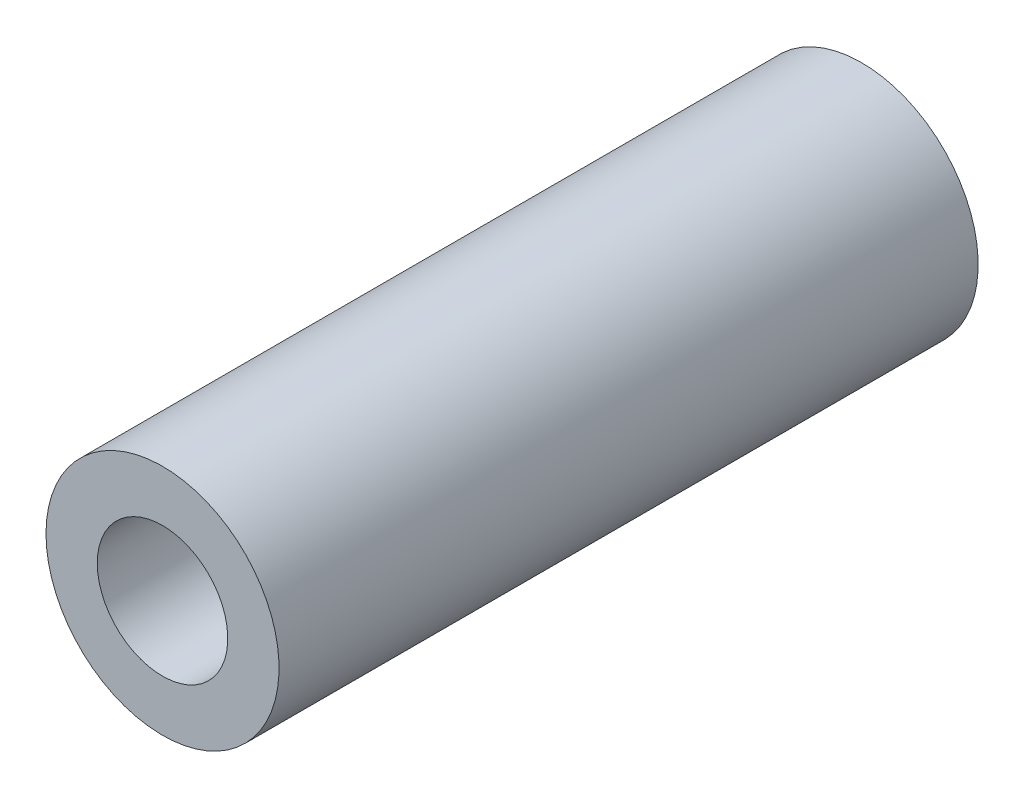
ISO-10303-21;
HEADER;
FILE_DESCRIPTION(('STEP AP214'),'2;1');
FILE_NAME('part.step','',(''),(''),'','','');
FILE_SCHEMA(('AUTOMOTIVE_DESIGN { 1 0 10303 214 1 1 1 1 }'));
ENDSEC;
DATA;
#1=APPLICATION_CONTEXT('core data for automotive mechanical design processes');
#2=APPLICATION_PROTOCOL_DEFINITION('international standard','automotive_design',2000,#1);
#3=PRODUCT_CONTEXT('',#1,'mechanical');
#4=PRODUCT('Part','Part','',(#3));
#5=PRODUCT_RELATED_PRODUCT_CATEGORY('part','',(#4));
#6=PRODUCT_DEFINITION_FORMATION('','',#4);
#7=PRODUCT_DEFINITION_CONTEXT('part definition',#1,'design');
#8=PRODUCT_DEFINITION('design','',#6,#7);
#9=PRODUCT_DEFINITION_SHAPE('','',#8);
#10=(LENGTH_UNIT() NAMED_UNIT(*) SI_UNIT(.MILLI.,.METRE.));
#11=(NAMED_UNIT(*) PLANE_ANGLE_UNIT() SI_UNIT($,.RADIAN.));
#12=(NAMED_UNIT(*) SI_UNIT($,.STERADIAN.) SOLID_ANGLE_UNIT());
#13=UNCERTAINTY_MEASURE_WITH_UNIT(LENGTH_MEASURE(1.E-05),#10,'distance_accuracy_value','');
#14=(GEOMETRIC_REPRESENTATION_CONTEXT(3) GLOBAL_UNCERTAINTY_ASSIGNED_CONTEXT((#13)) GLOBAL_UNIT_ASSIGNED_CONTEXT((#10,
#11,#12)) REPRESENTATION_CONTEXT('',''));
#15=CARTESIAN_POINT('',(0.,0.,0.));
#16=DIRECTION('',(0.,0.,1.));
#17=DIRECTION('',(1.,0.,0.));
#18=AXIS2_PLACEMENT_3D('',#15,#16,#17);
#19=CARTESIAN_POINT('',(0.,0.,9.525));
#20=DIRECTION('',(0.,0.,1.));
#21=DIRECTION('',(1.,0.,0.));
#22=AXIS2_PLACEMENT_3D('',#19,#20,#21);
#23=PLANE('',#22);
#24=CARTESIAN_POINT('',(0.,0.,9.525));
#25=DIRECTION('',(0.,0.,1.));
#26=DIRECTION('',(1.,0.,0.));
#27=AXIS2_PLACEMENT_3D('',#24,#25,#26);
#28=CIRCLE('',#27,3.175);
#29=CARTESIAN_POINT('',(-3.175,0.,9.525));
#30=VERTEX_POINT('',#29);
#31=EDGE_CURVE('E10',#30,#30,#28,.T.);
#32=ORIENTED_EDGE('',*,*,#31,.T.);
#33=EDGE_LOOP('',(#32));
#34=FACE_BOUND('',#33,.T.);
#35=CARTESIAN_POINT('',(0.,0.,9.525));
#36=DIRECTION('',(0.,0.,1.));
#37=DIRECTION('',(1.,0.,0.));
#38=AXIS2_PLACEMENT_3D('',#35,#36,#37);
#39=CIRCLE('',#38,1.778);
#40=CARTESIAN_POINT('',(-1.778,0.,9.525));
#41=VERTEX_POINT('',#40);
#42=EDGE_CURVE('E41',#41,#41,#39,.T.);
#43=ORIENTED_EDGE('',*,*,#42,.F.);
#44=EDGE_LOOP('',(#43));
#45=FACE_BOUND('',#44,.T.);
#46=ADVANCED_FACE('F30',(#34,#45),#23,.T.);
#47=CARTESIAN_POINT('',(0.,0.,-9.525));
#48=DIRECTION('',(0.,0.,1.));
#49=DIRECTION('',(1.,0.,0.));
#50=AXIS2_PLACEMENT_3D('',#47,#48,#49);
#51=PLANE('',#50);
#52=CARTESIAN_POINT('',(0.,0.,-9.525));
#53=DIRECTION('',(0.,0.,1.));
#54=DIRECTION('',(1.,0.,0.));
#55=AXIS2_PLACEMENT_3D('',#52,#53,#54);
#56=CIRCLE('',#55,3.175);
#57=CARTESIAN_POINT('',(-3.175,0.,-9.525));
#58=VERTEX_POINT('',#57);
#59=EDGE_CURVE('E34',#58,#58,#56,.T.);
#60=ORIENTED_EDGE('',*,*,#59,.F.);
#61=EDGE_LOOP('',(#60));
#62=FACE_BOUND('',#61,.T.);
#63=CARTESIAN_POINT('',(0.,0.,-9.525));
#64=DIRECTION('',(0.,0.,1.));
#65=DIRECTION('',(1.,0.,0.));
#66=AXIS2_PLACEMENT_3D('',#63,#64,#65);
#67=CIRCLE('',#66,1.778);
#68=CARTESIAN_POINT('',(-1.778,0.,-9.525));
#69=VERTEX_POINT('',#68);
#70=EDGE_CURVE('E43',#69,#69,#67,.T.);
#71=ORIENTED_EDGE('',*,*,#70,.T.);
#72=EDGE_LOOP('',(#71));
#73=FACE_BOUND('',#72,.T.);
#74=ADVANCED_FACE('F53',(#62,#73),#51,.F.);
#75=CARTESIAN_POINT('',(0.,0.,9.525));
#76=DIRECTION('',(0.,0.,-1.));
#77=DIRECTION('',(-1.,0.,0.));
#78=AXIS2_PLACEMENT_3D('',#75,#76,#77);
#79=CYLINDRICAL_SURFACE('',#78,3.175);
#80=CARTESIAN_POINT('',(-3.175,0.,9.525));
#81=CARTESIAN_POINT('',(-3.175,0.,9.3265625));
#82=CARTESIAN_POINT('',(-3.175,0.,9.128125));
#83=CARTESIAN_POINT('',(-3.175,0.,8.73125));
#84=CARTESIAN_POINT('',(-3.175,0.,8.5328125));
#85=CARTESIAN_POINT('',(-3.175,0.,8.1359375));
#86=CARTESIAN_POINT('',(-3.175,0.,7.9375));
#87=CARTESIAN_POINT('',(-3.175,0.,7.540625));
#88=CARTESIAN_POINT('',(-3.175,0.,7.3421875));
#89=CARTESIAN_POINT('',(-3.175,0.,6.9453125));
#90=CARTESIAN_POINT('',(-3.175,0.,6.746875));
#91=CARTESIAN_POINT('',(-3.175,0.,6.35));
#92=CARTESIAN_POINT('',(-3.175,0.,6.1515625));
#93=CARTESIAN_POINT('',(-3.175,0.,5.7546875));
#94=CARTESIAN_POINT('',(-3.175,0.,5.55625));
#95=CARTESIAN_POINT('',(-3.175,0.,5.159375));
#96=CARTESIAN_POINT('',(-3.175,0.,4.9609375));
#97=CARTESIAN_POINT('',(-3.175,0.,4.5640625));
#98=CARTESIAN_POINT('',(-3.175,0.,4.365625));
#99=CARTESIAN_POINT('',(-3.175,0.,3.96875));
#100=CARTESIAN_POINT('',(-3.175,0.,3.7703125));
#101=CARTESIAN_POINT('',(-3.175,0.,3.3734375));
#102=CARTESIAN_POINT('',(-3.175,0.,3.175));
#103=CARTESIAN_POINT('',(-3.175,0.,2.778125));
#104=CARTESIAN_POINT('',(-3.175,0.,2.5796875));
#105=CARTESIAN_POINT('',(-3.175,0.,2.1828125));
#106=CARTESIAN_POINT('',(-3.175,0.,1.984375));
#107=CARTESIAN_POINT('',(-3.175,0.,1.5875));
#108=CARTESIAN_POINT('',(-3.175,0.,1.3890625));
#109=CARTESIAN_POINT('',(-3.175,0.,0.992187499999999));
#110=CARTESIAN_POINT('',(-3.175,0.,0.793749999999999));
#111=CARTESIAN_POINT('',(-3.175,0.,0.396874999999998));
#112=CARTESIAN_POINT('',(-3.175,0.,0.198437499999998));
#113=CARTESIAN_POINT('',(-3.175,0.,-0.198437500000002));
#114=CARTESIAN_POINT('',(-3.175,0.,-0.396875000000002));
#115=CARTESIAN_POINT('',(-3.175,0.,-0.793750000000002));
#116=CARTESIAN_POINT('',(-3.175,0.,-0.992187500000002));
#117=CARTESIAN_POINT('',(-3.175,0.,-1.3890625));
#118=CARTESIAN_POINT('',(-3.175,0.,-1.5875));
#119=CARTESIAN_POINT('',(-3.175,0.,-1.984375));
#120=CARTESIAN_POINT('',(-3.175,0.,-2.1828125));
#121=CARTESIAN_POINT('',(-3.175,0.,-2.5796875));
#122=CARTESIAN_POINT('',(-3.175,0.,-2.778125));
#123=CARTESIAN_POINT('',(-3.175,0.,-3.175));
#124=CARTESIAN_POINT('',(-3.175,0.,-3.3734375));
#125=CARTESIAN_POINT('',(-3.175,0.,-3.7703125));
#126=CARTESIAN_POINT('',(-3.175,0.,-3.96875));
#127=CARTESIAN_POINT('',(-3.175,0.,-4.365625));
#128=CARTESIAN_POINT('',(-3.175,0.,-4.5640625));
#129=CARTESIAN_POINT('',(-3.175,0.,-4.9609375));
#130=CARTESIAN_POINT('',(-3.175,0.,-5.159375));
#131=CARTESIAN_POINT('',(-3.175,0.,-5.55625));
#132=CARTESIAN_POINT('',(-3.175,0.,-5.7546875));
#133=CARTESIAN_POINT('',(-3.175,0.,-6.1515625));
#134=CARTESIAN_POINT('',(-3.175,0.,-6.35));
#135=CARTESIAN_POINT('',(-3.175,0.,-6.746875));
#136=CARTESIAN_POINT('',(-3.175,0.,-6.9453125));
#137=CARTESIAN_POINT('',(-3.175,0.,-7.3421875));
#138=CARTESIAN_POINT('',(-3.175,0.,-7.540625));
#139=CARTESIAN_POINT('',(-3.175,0.,-7.9375));
#140=CARTESIAN_POINT('',(-3.175,0.,-8.1359375));
#141=CARTESIAN_POINT('',(-3.175,0.,-8.5328125));
#142=CARTESIAN_POINT('',(-3.175,0.,-8.73125));
#143=CARTESIAN_POINT('',(-3.175,0.,-9.128125));
#144=CARTESIAN_POINT('',(-3.175,0.,-9.3265625));
#145=CARTESIAN_POINT('',(-3.175,0.,-9.525));
#146=B_SPLINE_CURVE_WITH_KNOTS('',3,(#80,#81,#82,#83,#84,#85,#86,#87,#88,#89,#90,#91,#92,#93,
#94,#95,#96,#97,#98,#99,#100,#101,#102,#103,#104,#105,#106,#107,#108,#109,#110,#111,#112,#113,
#114,#115,#116,#117,#118,#119,#120,#121,#122,#123,#124,#125,#126,#127,#128,#129,#130,#131,#132,
#133,#134,#135,#136,#137,#138,#139,#140,#141,#142,#143,#144,#145),.UNSPECIFIED.,.F.,.F.,(4,2,2,
2,2,2,2,2,2,2,2,2,2,2,2,2,2,2,2,2,2,2,2,2,2,2,2,2,2,2,2,2,4),(0.,0.595312499999999,1.190625,
1.7859375,2.38125,2.9765625,3.571875,4.1671875,4.7625,5.3578125,5.953125,6.5484375,7.14375,
7.7390625,8.334375,8.9296875,9.525,10.1203125,10.715625,11.3109375,11.90625,12.5015625,
13.096875,13.6921875,14.2875,14.8828125,15.478125,16.0734375,16.66875,17.2640625,17.859375,
18.4546875,19.05),.UNSPECIFIED.);
#147=EDGE_CURVE('BSEAM32',#30,#58,#146,.T.);
#148=ORIENTED_EDGE('',*,*,#31,.F.);
#149=ORIENTED_EDGE('',*,*,#59,.T.);
#150=ORIENTED_EDGE('',*,*,#147,.T.);
#151=ORIENTED_EDGE('',*,*,#147,.F.);
#152=EDGE_LOOP('',(#148,#150,#149,#151));
#153=FACE_BOUND('',#152,.T.);
#154=ADVANCED_FACE('F32',(#153),#79,.T.);
#155=CARTESIAN_POINT('',(0.,0.,9.525));
#156=DIRECTION('',(0.,0.,-1.));
#157=DIRECTION('',(-1.,0.,0.));
#158=AXIS2_PLACEMENT_3D('',#155,#156,#157);
#159=CYLINDRICAL_SURFACE('',#158,1.778);
#160=CARTESIAN_POINT('',(-1.778,0.,9.525));
#161=CARTESIAN_POINT('',(-1.778,0.,9.3265625));
#162=CARTESIAN_POINT('',(-1.778,0.,9.128125));
#163=CARTESIAN_POINT('',(-1.778,0.,8.73125));
#164=CARTESIAN_POINT('',(-1.778,0.,8.5328125));
#165=CARTESIAN_POINT('',(-1.778,0.,8.1359375));
#166=CARTESIAN_POINT('',(-1.778,0.,7.9375));
#167=CARTESIAN_POINT('',(-1.778,0.,7.540625));
#168=CARTESIAN_POINT('',(-1.778,0.,7.3421875));
#169=CARTESIAN_POINT('',(-1.778,0.,6.9453125));
#170=CARTESIAN_POINT('',(-1.778,0.,6.746875));
#171=CARTESIAN_POINT('',(-1.778,0.,6.35));
#172=CARTESIAN_POINT('',(-1.778,0.,6.1515625));
#173=CARTESIAN_POINT('',(-1.778,0.,5.7546875));
#174=CARTESIAN_POINT('',(-1.778,0.,5.55625));
#175=CARTESIAN_POINT('',(-1.778,0.,5.159375));
#176=CARTESIAN_POINT('',(-1.778,0.,4.9609375));
#177=CARTESIAN_POINT('',(-1.778,0.,4.5640625));
#178=CARTESIAN_POINT('',(-1.778,0.,4.365625));
#179=CARTESIAN_POINT('',(-1.778,0.,3.96875));
#180=CARTESIAN_POINT('',(-1.778,0.,3.7703125));
#181=CARTESIAN_POINT('',(-1.778,0.,3.3734375));
#182=CARTESIAN_POINT('',(-1.778,0.,3.175));
#183=CARTESIAN_POINT('',(-1.778,0.,2.778125));
#184=CARTESIAN_POINT('',(-1.778,0.,2.5796875));
#185=CARTESIAN_POINT('',(-1.778,0.,2.1828125));
#186=CARTESIAN_POINT('',(-1.778,0.,1.984375));
#187=CARTESIAN_POINT('',(-1.778,0.,1.5875));
#188=CARTESIAN_POINT('',(-1.778,0.,1.3890625));
#189=CARTESIAN_POINT('',(-1.778,0.,0.992187500000001));
#190=CARTESIAN_POINT('',(-1.778,0.,0.793750000000001));
#191=CARTESIAN_POINT('',(-1.778,0.,0.396875));
#192=CARTESIAN_POINT('',(-1.778,0.,0.1984375));
#193=CARTESIAN_POINT('',(-1.778,0.,-0.1984375));
#194=CARTESIAN_POINT('',(-1.778,0.,-0.396875));
#195=CARTESIAN_POINT('',(-1.778,0.,-0.793750000000001));
#196=CARTESIAN_POINT('',(-1.778,0.,-0.992187500000001));
#197=CARTESIAN_POINT('',(-1.778,0.,-1.3890625));
#198=CARTESIAN_POINT('',(-1.778,0.,-1.5875));
#199=CARTESIAN_POINT('',(-1.778,0.,-1.984375));
#200=CARTESIAN_POINT('',(-1.778,0.,-2.1828125));
#201=CARTESIAN_POINT('',(-1.778,0.,-2.5796875));
#202=CARTESIAN_POINT('',(-1.778,0.,-2.778125));
#203=CARTESIAN_POINT('',(-1.778,0.,-3.175));
#204=CARTESIAN_POINT('',(-1.778,0.,-3.3734375));
#205=CARTESIAN_POINT('',(-1.778,0.,-3.7703125));
#206=CARTESIAN_POINT('',(-1.778,0.,-3.96875));
#207=CARTESIAN_POINT('',(-1.778,0.,-4.365625));
#208=CARTESIAN_POINT('',(-1.778,0.,-4.5640625));
#209=CARTESIAN_POINT('',(-1.778,0.,-4.9609375));
#210=CARTESIAN_POINT('',(-1.778,0.,-5.159375));
#211=CARTESIAN_POINT('',(-1.778,0.,-5.55625));
#212=CARTESIAN_POINT('',(-1.778,0.,-5.7546875));
#213=CARTESIAN_POINT('',(-1.778,0.,-6.1515625));
#214=CARTESIAN_POINT('',(-1.778,0.,-6.35));
#215=CARTESIAN_POINT('',(-1.778,0.,-6.746875));
#216=CARTESIAN_POINT('',(-1.778,0.,-6.9453125));
#217=CARTESIAN_POINT('',(-1.778,0.,-7.3421875));
#218=CARTESIAN_POINT('',(-1.778,0.,-7.540625));
#219=CARTESIAN_POINT('',(-1.778,0.,-7.9375));
#220=CARTESIAN_POINT('',(-1.778,0.,-8.1359375));
#221=CARTESIAN_POINT('',(-1.778,0.,-8.5328125));
#222=CARTESIAN_POINT('',(-1.778,0.,-8.73125));
#223=CARTESIAN_POINT('',(-1.778,0.,-9.128125));
#224=CARTESIAN_POINT('',(-1.778,0.,-9.3265625));
#225=CARTESIAN_POINT('',(-1.778,0.,-9.525));
#226=B_SPLINE_CURVE_WITH_KNOTS('',3,(#160,#161,#162,#163,#164,#165,#166,#167,#168,#169,#170,
#171,#172,#173,#174,#175,#176,#177,#178,#179,#180,#181,#182,#183,#184,#185,#186,#187,#188,#189,
#190,#191,#192,#193,#194,#195,#196,#197,#198,#199,#200,#201,#202,#203,#204,#205,#206,#207,#208,
#209,#210,#211,#212,#213,#214,#215,#216,#217,#218,#219,#220,#221,#222,#223,#224,#225),
.UNSPECIFIED.,.F.,.F.,(4,2,2,2,2,2,2,2,2,2,2,2,2,2,2,2,2,2,2,2,2,2,2,2,2,2,2,2,2,2,2,2,4),(0.,
0.5953125,1.190625,1.7859375,2.38125,2.9765625,3.571875,4.1671875,4.7625,5.3578125,5.953125,
6.5484375,7.14375,7.7390625,8.334375,8.9296875,9.525,10.1203125,10.715625,11.3109375,11.90625,
12.5015625,13.096875,13.6921875,14.2875,14.8828125,15.478125,16.0734375,16.66875,17.2640625,
17.859375,18.4546875,19.05),.UNSPECIFIED.);
#227=EDGE_CURVE('BSEAM49',#41,#69,#226,.T.);
#228=ORIENTED_EDGE('',*,*,#42,.T.);
#229=ORIENTED_EDGE('',*,*,#70,.F.);
#230=ORIENTED_EDGE('',*,*,#227,.T.);
#231=ORIENTED_EDGE('',*,*,#227,.F.);
#232=EDGE_LOOP('',(#228,#230,#229,#231));
#233=FACE_BOUND('',#232,.T.);
#234=ADVANCED_FACE('F49',(#233),#159,.F.);
#235=CLOSED_SHELL('',(#46,#74,#154,#234));
#236=MANIFOLD_SOLID_BREP('B2',#235);
#237=ADVANCED_BREP_SHAPE_REPRESENTATION('',(#18,#236),#14);
#238=SHAPE_DEFINITION_REPRESENTATION(#9,#237);
ENDSEC;
END-ISO-10303-21;
